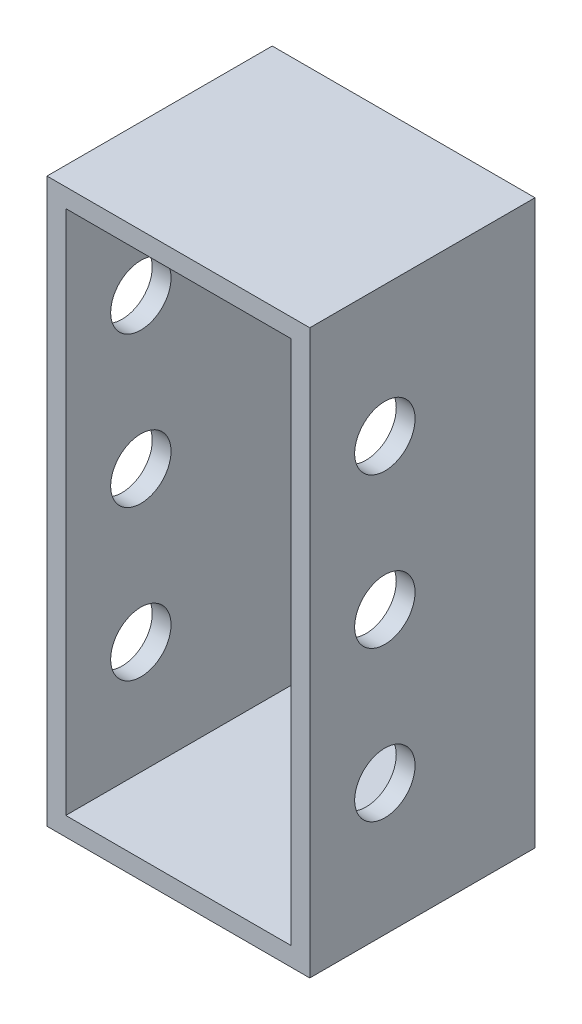
ISO-10303-21;
HEADER;
FILE_DESCRIPTION(('STEP AP214'),'2;1');
FILE_NAME('part.step','',(''),(''),'','','');
FILE_SCHEMA(('AUTOMOTIVE_DESIGN { 1 0 10303 214 1 1 1 1 }'));
ENDSEC;
DATA;
#1=APPLICATION_CONTEXT('core data for automotive mechanical design processes');
#2=APPLICATION_PROTOCOL_DEFINITION('international standard','automotive_design',2000,#1);
#3=PRODUCT_CONTEXT('',#1,'mechanical');
#4=PRODUCT('Part','Part','',(#3));
#5=PRODUCT_RELATED_PRODUCT_CATEGORY('part','',(#4));
#6=PRODUCT_DEFINITION_FORMATION('','',#4);
#7=PRODUCT_DEFINITION_CONTEXT('part definition',#1,'design');
#8=PRODUCT_DEFINITION('design','',#6,#7);
#9=PRODUCT_DEFINITION_SHAPE('','',#8);
#10=(LENGTH_UNIT() NAMED_UNIT(*) SI_UNIT(.MILLI.,.METRE.));
#11=(NAMED_UNIT(*) PLANE_ANGLE_UNIT() SI_UNIT($,.RADIAN.));
#12=(NAMED_UNIT(*) SI_UNIT($,.STERADIAN.) SOLID_ANGLE_UNIT());
#13=UNCERTAINTY_MEASURE_WITH_UNIT(LENGTH_MEASURE(1.E-05),#10,'distance_accuracy_value','');
#14=(GEOMETRIC_REPRESENTATION_CONTEXT(3) GLOBAL_UNCERTAINTY_ASSIGNED_CONTEXT((#13)) GLOBAL_UNIT_ASSIGNED_CONTEXT((#10,
#11,#12)) REPRESENTATION_CONTEXT('',''));
#15=CARTESIAN_POINT('',(0.,0.,0.));
#16=DIRECTION('',(0.,0.,1.));
#17=DIRECTION('',(1.,0.,0.));
#18=AXIS2_PLACEMENT_3D('',#15,#16,#17);
#19=CARTESIAN_POINT('',(0.,23.8125,0.));
#20=DIRECTION('',(0.,0.,1.));
#21=DIRECTION('',(-1.,0.,0.));
#22=AXIS2_PLACEMENT_3D('',#19,#20,#21);
#23=PLANE('',#22);
#24=DIRECTION('',(1.,0.,0.));
#25=VECTOR('',#24,1.);
#26=CARTESIAN_POINT('',(0.,-23.8125,0.));
#27=LINE('',#26,#25);
#28=CARTESIAN_POINT('',(0.,-23.8125,0.));
#29=VERTEX_POINT('',#28);
#30=CARTESIAN_POINT('',(22.225,-23.8125,0.));
#31=VERTEX_POINT('',#30);
#32=EDGE_CURVE('E180',#29,#31,#27,.T.);
#33=ORIENTED_EDGE('',*,*,#32,.F.);
#34=DIRECTION('',(0.,-1.,0.));
#35=VECTOR('',#34,1.);
#36=CARTESIAN_POINT('',(0.,23.8125,0.));
#37=LINE('',#36,#35);
#38=CARTESIAN_POINT('',(0.,23.8125,0.));
#39=VERTEX_POINT('',#38);
#40=EDGE_CURVE('E11',#39,#29,#37,.T.);
#41=ORIENTED_EDGE('',*,*,#40,.F.);
#42=DIRECTION('',(1.,0.,0.));
#43=VECTOR('',#42,1.);
#44=CARTESIAN_POINT('',(0.,23.8125,0.));
#45=LINE('',#44,#43);
#46=CARTESIAN_POINT('',(22.225,23.8125,0.));
#47=VERTEX_POINT('',#46);
#48=EDGE_CURVE('E169',#39,#47,#45,.T.);
#49=ORIENTED_EDGE('',*,*,#48,.T.);
#50=DIRECTION('',(0.,-1.,0.));
#51=VECTOR('',#50,1.);
#52=CARTESIAN_POINT('',(22.225,23.8125,0.));
#53=LINE('',#52,#51);
#54=EDGE_CURVE('E45',#47,#31,#53,.T.);
#55=ORIENTED_EDGE('',*,*,#54,.T.);
#56=EDGE_LOOP('',(#33,#41,#49,#55));
#57=FACE_BOUND('',#56,.T.);
#58=DIRECTION('',(1.,0.,0.));
#59=VECTOR('',#58,1.);
#60=CARTESIAN_POINT('',(0.,-22.225,0.));
#61=LINE('',#60,#59);
#62=CARTESIAN_POINT('',(1.5875,-22.225,0.));
#63=VERTEX_POINT('',#62);
#64=CARTESIAN_POINT('',(20.6375,-22.225,0.));
#65=VERTEX_POINT('',#64);
#66=EDGE_CURVE('E111',#63,#65,#61,.T.);
#67=ORIENTED_EDGE('',*,*,#66,.T.);
#68=DIRECTION('',(0.,-1.,0.));
#69=VECTOR('',#68,1.);
#70=CARTESIAN_POINT('',(20.6375,23.8125,0.));
#71=LINE('',#70,#69);
#72=CARTESIAN_POINT('',(20.6375,22.225,0.));
#73=VERTEX_POINT('',#72);
#74=EDGE_CURVE('E119',#73,#65,#71,.T.);
#75=ORIENTED_EDGE('',*,*,#74,.F.);
#76=DIRECTION('',(1.,0.,0.));
#77=VECTOR('',#76,1.);
#78=CARTESIAN_POINT('',(0.,22.225,0.));
#79=LINE('',#78,#77);
#80=CARTESIAN_POINT('',(1.5875,22.225,0.));
#81=VERTEX_POINT('',#80);
#82=EDGE_CURVE('E117',#81,#73,#79,.T.);
#83=ORIENTED_EDGE('',*,*,#82,.F.);
#84=DIRECTION('',(0.,-1.,0.));
#85=VECTOR('',#84,1.);
#86=CARTESIAN_POINT('',(1.5875,23.8125,0.));
#87=LINE('',#86,#85);
#88=EDGE_CURVE('E103',#81,#63,#87,.T.);
#89=ORIENTED_EDGE('',*,*,#88,.T.);
#90=EDGE_LOOP('',(#67,#75,#83,#89));
#91=FACE_BOUND('',#90,.T.);
#92=ADVANCED_FACE('F37',(#57,#91),#23,.F.);
#93=CARTESIAN_POINT('',(0.,23.8125,19.05));
#94=DIRECTION('',(0.,0.,-1.));
#95=DIRECTION('',(1.,0.,0.));
#96=AXIS2_PLACEMENT_3D('',#93,#94,#95);
#97=PLANE('',#96);
#98=DIRECTION('',(-1.,0.,0.));
#99=VECTOR('',#98,1.);
#100=CARTESIAN_POINT('',(0.,-23.8125,19.05));
#101=LINE('',#100,#99);
#102=CARTESIAN_POINT('',(22.225,-23.8125,19.05));
#103=VERTEX_POINT('',#102);
#104=CARTESIAN_POINT('',(0.,-23.8125,19.05));
#105=VERTEX_POINT('',#104);
#106=EDGE_CURVE('E170',#103,#105,#101,.T.);
#107=ORIENTED_EDGE('',*,*,#106,.F.);
#108=DIRECTION('',(0.,-1.,0.));
#109=VECTOR('',#108,1.);
#110=CARTESIAN_POINT('',(22.225,23.8125,19.05));
#111=LINE('',#110,#109);
#112=CARTESIAN_POINT('',(22.225,23.8125,19.05));
#113=VERTEX_POINT('',#112);
#114=EDGE_CURVE('E189',#113,#103,#111,.T.);
#115=ORIENTED_EDGE('',*,*,#114,.F.);
#116=DIRECTION('',(-1.,0.,0.));
#117=VECTOR('',#116,1.);
#118=CARTESIAN_POINT('',(0.,23.8125,19.05));
#119=LINE('',#118,#117);
#120=CARTESIAN_POINT('',(0.,23.8125,19.05));
#121=VERTEX_POINT('',#120);
#122=EDGE_CURVE('E175',#113,#121,#119,.T.);
#123=ORIENTED_EDGE('',*,*,#122,.T.);
#124=DIRECTION('',(0.,-1.,0.));
#125=VECTOR('',#124,1.);
#126=CARTESIAN_POINT('',(0.,23.8125,19.05));
#127=LINE('',#126,#125);
#128=EDGE_CURVE('E178',#121,#105,#127,.T.);
#129=ORIENTED_EDGE('',*,*,#128,.T.);
#130=EDGE_LOOP('',(#107,#115,#123,#129));
#131=FACE_BOUND('',#130,.T.);
#132=DIRECTION('',(-1.,0.,0.));
#133=VECTOR('',#132,1.);
#134=CARTESIAN_POINT('',(0.,-22.225,19.05));
#135=LINE('',#134,#133);
#136=CARTESIAN_POINT('',(20.6375,-22.225,19.05));
#137=VERTEX_POINT('',#136);
#138=CARTESIAN_POINT('',(1.5875,-22.225,19.05));
#139=VERTEX_POINT('',#138);
#140=EDGE_CURVE('E125',#137,#139,#135,.T.);
#141=ORIENTED_EDGE('',*,*,#140,.T.);
#142=DIRECTION('',(0.,-1.,0.));
#143=VECTOR('',#142,1.);
#144=CARTESIAN_POINT('',(1.5875,23.8125,19.05));
#145=LINE('',#144,#143);
#146=CARTESIAN_POINT('',(1.5875,22.225,19.05));
#147=VERTEX_POINT('',#146);
#148=EDGE_CURVE('E106',#147,#139,#145,.T.);
#149=ORIENTED_EDGE('',*,*,#148,.F.);
#150=DIRECTION('',(-1.,0.,0.));
#151=VECTOR('',#150,1.);
#152=CARTESIAN_POINT('',(0.,22.225,19.05));
#153=LINE('',#152,#151);
#154=CARTESIAN_POINT('',(20.6375,22.225,19.05));
#155=VERTEX_POINT('',#154);
#156=EDGE_CURVE('E133',#155,#147,#153,.T.);
#157=ORIENTED_EDGE('',*,*,#156,.F.);
#158=DIRECTION('',(0.,-1.,0.));
#159=VECTOR('',#158,1.);
#160=CARTESIAN_POINT('',(20.6375,23.8125,19.05));
#161=LINE('',#160,#159);
#162=EDGE_CURVE('E130',#155,#137,#161,.T.);
#163=ORIENTED_EDGE('',*,*,#162,.T.);
#164=EDGE_LOOP('',(#141,#149,#157,#163));
#165=FACE_BOUND('',#164,.T.);
#166=ADVANCED_FACE('F209',(#131,#165),#97,.F.);
#167=CARTESIAN_POINT('',(22.225,0.,12.7));
#168=DIRECTION('',(-1.,0.,0.));
#169=DIRECTION('',(0.,0.,-1.));
#170=AXIS2_PLACEMENT_3D('',#167,#168,#169);
#171=CYLINDRICAL_SURFACE('',#170,2.5527);
#172=CARTESIAN_POINT('',(0.,0.,12.7));
#173=DIRECTION('',(1.,0.,0.));
#174=DIRECTION('',(0.,0.,-1.));
#175=AXIS2_PLACEMENT_3D('',#172,#173,#174);
#176=CIRCLE('',#175,2.5527);
#177=CARTESIAN_POINT('',(0.,0.,10.1473));
#178=VERTEX_POINT('',#177);
#179=EDGE_CURVE('E118',#178,#178,#176,.T.);
#180=ORIENTED_EDGE('',*,*,#179,.F.);
#181=EDGE_LOOP('',(#180));
#182=FACE_BOUND('',#181,.T.);
#183=CARTESIAN_POINT('',(1.5875,0.,12.7));
#184=DIRECTION('',(-1.,0.,0.));
#185=DIRECTION('',(0.,0.,1.));
#186=AXIS2_PLACEMENT_3D('',#183,#184,#185);
#187=CIRCLE('',#186,2.5527);
#188=CARTESIAN_POINT('',(1.5875,0.,15.2527));
#189=VERTEX_POINT('',#188);
#190=EDGE_CURVE('E148',#189,#189,#187,.F.);
#191=ORIENTED_EDGE('',*,*,#190,.T.);
#192=EDGE_LOOP('',(#191));
#193=FACE_BOUND('',#192,.T.);
#194=ADVANCED_FACE('F212',(#182,#193),#171,.F.);
#195=CARTESIAN_POINT('',(22.225,-12.7,12.7));
#196=DIRECTION('',(-1.,0.,0.));
#197=DIRECTION('',(0.,0.,-1.));
#198=AXIS2_PLACEMENT_3D('',#195,#196,#197);
#199=CYLINDRICAL_SURFACE('',#198,2.5527);
#200=CARTESIAN_POINT('',(0.,-12.7,12.7));
#201=DIRECTION('',(1.,0.,0.));
#202=DIRECTION('',(0.,0.,-1.));
#203=AXIS2_PLACEMENT_3D('',#200,#201,#202);
#204=CIRCLE('',#203,2.5527);
#205=CARTESIAN_POINT('',(0.,-12.7,10.1473));
#206=VERTEX_POINT('',#205);
#207=EDGE_CURVE('E159',#206,#206,#204,.T.);
#208=ORIENTED_EDGE('',*,*,#207,.F.);
#209=EDGE_LOOP('',(#208));
#210=FACE_BOUND('',#209,.T.);
#211=CARTESIAN_POINT('',(1.5875,-12.7,12.7));
#212=DIRECTION('',(-1.,0.,0.));
#213=DIRECTION('',(0.,0.,1.));
#214=AXIS2_PLACEMENT_3D('',#211,#212,#213);
#215=CIRCLE('',#214,2.5527);
#216=CARTESIAN_POINT('',(1.5875,-12.7,15.2527));
#217=VERTEX_POINT('',#216);
#218=EDGE_CURVE('E144',#217,#217,#215,.F.);
#219=ORIENTED_EDGE('',*,*,#218,.T.);
#220=EDGE_LOOP('',(#219));
#221=FACE_BOUND('',#220,.T.);
#222=ADVANCED_FACE('F248',(#210,#221),#199,.F.);
#223=CARTESIAN_POINT('',(22.225,12.7,12.7));
#224=DIRECTION('',(-1.,0.,0.));
#225=DIRECTION('',(0.,0.,-1.));
#226=AXIS2_PLACEMENT_3D('',#223,#224,#225);
#227=CYLINDRICAL_SURFACE('',#226,2.5527);
#228=CARTESIAN_POINT('',(0.,12.7,12.7));
#229=DIRECTION('',(1.,0.,0.));
#230=DIRECTION('',(0.,0.,-1.));
#231=AXIS2_PLACEMENT_3D('',#228,#229,#230);
#232=CIRCLE('',#231,2.5527);
#233=CARTESIAN_POINT('',(0.,12.7,10.1473));
#234=VERTEX_POINT('',#233);
#235=EDGE_CURVE('E153',#234,#234,#232,.T.);
#236=ORIENTED_EDGE('',*,*,#235,.F.);
#237=EDGE_LOOP('',(#236));
#238=FACE_BOUND('',#237,.T.);
#239=CARTESIAN_POINT('',(1.5875,12.7,12.7));
#240=DIRECTION('',(-1.,0.,0.));
#241=DIRECTION('',(0.,0.,1.));
#242=AXIS2_PLACEMENT_3D('',#239,#240,#241);
#243=CIRCLE('',#242,2.5527);
#244=CARTESIAN_POINT('',(1.5875,12.7,15.2527));
#245=VERTEX_POINT('',#244);
#246=EDGE_CURVE('E140',#245,#245,#243,.F.);
#247=ORIENTED_EDGE('',*,*,#246,.T.);
#248=EDGE_LOOP('',(#247));
#249=FACE_BOUND('',#248,.T.);
#250=ADVANCED_FACE('F251',(#238,#249),#227,.F.);
#251=CARTESIAN_POINT('',(0.,23.8125,0.));
#252=DIRECTION('',(1.,0.,0.));
#253=DIRECTION('',(0.,0.,1.));
#254=AXIS2_PLACEMENT_3D('',#251,#252,#253);
#255=PLANE('',#254);
#256=ORIENTED_EDGE('',*,*,#235,.T.);
#257=EDGE_LOOP('',(#256));
#258=FACE_BOUND('',#257,.T.);
#259=ORIENTED_EDGE('',*,*,#207,.T.);
#260=EDGE_LOOP('',(#259));
#261=FACE_BOUND('',#260,.T.);
#262=ORIENTED_EDGE('',*,*,#179,.T.);
#263=EDGE_LOOP('',(#262));
#264=FACE_BOUND('',#263,.T.);
#265=DIRECTION('',(0.,0.,-1.));
#266=VECTOR('',#265,1.);
#267=CARTESIAN_POINT('',(0.,-23.8125,0.));
#268=LINE('',#267,#266);
#269=EDGE_CURVE('E152',#105,#29,#268,.T.);
#270=ORIENTED_EDGE('',*,*,#269,.F.);
#271=ORIENTED_EDGE('',*,*,#128,.F.);
#272=DIRECTION('',(0.,0.,-1.));
#273=VECTOR('',#272,1.);
#274=CARTESIAN_POINT('',(0.,23.8125,0.));
#275=LINE('',#274,#273);
#276=EDGE_CURVE('E167',#121,#39,#275,.T.);
#277=ORIENTED_EDGE('',*,*,#276,.T.);
#278=ORIENTED_EDGE('',*,*,#40,.T.);
#279=EDGE_LOOP('',(#270,#271,#277,#278));
#280=FACE_BOUND('',#279,.T.);
#281=ADVANCED_FACE('F39',(#258,#261,#264,#280),#255,.F.);
#282=CARTESIAN_POINT('',(22.225,23.8125,0.));
#283=DIRECTION('',(-1.,0.,0.));
#284=DIRECTION('',(0.,0.,-1.));
#285=AXIS2_PLACEMENT_3D('',#282,#283,#284);
#286=PLANE('',#285);
#287=CARTESIAN_POINT('',(22.225,12.7,12.7));
#288=DIRECTION('',(1.,0.,0.));
#289=DIRECTION('',(0.,0.,-1.));
#290=AXIS2_PLACEMENT_3D('',#287,#288,#289);
#291=CIRCLE('',#290,2.5527);
#292=CARTESIAN_POINT('',(22.225,12.7,10.1473));
#293=VERTEX_POINT('',#292);
#294=EDGE_CURVE('E149',#293,#293,#291,.T.);
#295=ORIENTED_EDGE('',*,*,#294,.F.);
#296=EDGE_LOOP('',(#295));
#297=FACE_BOUND('',#296,.T.);
#298=CARTESIAN_POINT('',(22.225,-12.7,12.7));
#299=DIRECTION('',(1.,0.,0.));
#300=DIRECTION('',(0.,0.,-1.));
#301=AXIS2_PLACEMENT_3D('',#298,#299,#300);
#302=CIRCLE('',#301,2.5527);
#303=CARTESIAN_POINT('',(22.225,-12.7,10.1473));
#304=VERTEX_POINT('',#303);
#305=EDGE_CURVE('E156',#304,#304,#302,.T.);
#306=ORIENTED_EDGE('',*,*,#305,.F.);
#307=EDGE_LOOP('',(#306));
#308=FACE_BOUND('',#307,.T.);
#309=CARTESIAN_POINT('',(22.225,0.,12.7));
#310=DIRECTION('',(1.,0.,0.));
#311=DIRECTION('',(0.,0.,-1.));
#312=AXIS2_PLACEMENT_3D('',#309,#310,#311);
#313=CIRCLE('',#312,2.5527);
#314=CARTESIAN_POINT('',(22.225,0.,10.1473));
#315=VERTEX_POINT('',#314);
#316=EDGE_CURVE('E162',#315,#315,#313,.T.);
#317=ORIENTED_EDGE('',*,*,#316,.F.);
#318=EDGE_LOOP('',(#317));
#319=FACE_BOUND('',#318,.T.);
#320=DIRECTION('',(0.,0.,1.));
#321=VECTOR('',#320,1.);
#322=CARTESIAN_POINT('',(22.225,-23.8125,0.));
#323=LINE('',#322,#321);
#324=EDGE_CURVE('E183',#31,#103,#323,.T.);
#325=ORIENTED_EDGE('',*,*,#324,.F.);
#326=ORIENTED_EDGE('',*,*,#54,.F.);
#327=DIRECTION('',(0.,0.,1.));
#328=VECTOR('',#327,1.);
#329=CARTESIAN_POINT('',(22.225,23.8125,0.));
#330=LINE('',#329,#328);
#331=EDGE_CURVE('E173',#47,#113,#330,.T.);
#332=ORIENTED_EDGE('',*,*,#331,.T.);
#333=ORIENTED_EDGE('',*,*,#114,.T.);
#334=EDGE_LOOP('',(#325,#326,#332,#333));
#335=FACE_BOUND('',#334,.T.);
#336=ADVANCED_FACE('F207',(#297,#308,#319,#335),#286,.F.);
#337=CARTESIAN_POINT('',(0.,23.8125,0.));
#338=DIRECTION('',(0.,-1.,0.));
#339=DIRECTION('',(0.,0.,1.));
#340=AXIS2_PLACEMENT_3D('',#337,#338,#339);
#341=PLANE('',#340);
#342=ORIENTED_EDGE('',*,*,#276,.F.);
#343=ORIENTED_EDGE('',*,*,#122,.F.);
#344=ORIENTED_EDGE('',*,*,#331,.F.);
#345=ORIENTED_EDGE('',*,*,#48,.F.);
#346=EDGE_LOOP('',(#342,#343,#344,#345));
#347=FACE_BOUND('',#346,.T.);
#348=ADVANCED_FACE('F205',(#347),#341,.F.);
#349=CARTESIAN_POINT('',(0.,-23.8125,0.));
#350=DIRECTION('',(0.,-1.,0.));
#351=DIRECTION('',(0.,0.,1.));
#352=AXIS2_PLACEMENT_3D('',#349,#350,#351);
#353=PLANE('',#352);
#354=ORIENTED_EDGE('',*,*,#269,.T.);
#355=ORIENTED_EDGE('',*,*,#32,.T.);
#356=ORIENTED_EDGE('',*,*,#324,.T.);
#357=ORIENTED_EDGE('',*,*,#106,.T.);
#358=EDGE_LOOP('',(#354,#355,#356,#357));
#359=FACE_BOUND('',#358,.T.);
#360=ADVANCED_FACE('F199',(#359),#353,.T.);
#361=CARTESIAN_POINT('',(20.6375,0.,12.7));
#362=DIRECTION('',(1.,0.,0.));
#363=DIRECTION('',(0.,0.,-1.));
#364=AXIS2_PLACEMENT_3D('',#361,#362,#363);
#365=CIRCLE('',#364,2.5527);
#366=CARTESIAN_POINT('',(20.6375,0.,10.1473));
#367=VERTEX_POINT('',#366);
#368=EDGE_CURVE('E145',#367,#367,#365,.T.);
#369=ORIENTED_EDGE('',*,*,#368,.F.);
#370=EDGE_LOOP('',(#369));
#371=FACE_BOUND('',#370,.T.);
#372=ORIENTED_EDGE('',*,*,#316,.T.);
#373=EDGE_LOOP('',(#372));
#374=FACE_BOUND('',#373,.T.);
#375=ADVANCED_FACE('F237',(#371,#374),#171,.F.);
#376=CARTESIAN_POINT('',(20.6375,-12.7,12.7));
#377=DIRECTION('',(1.,0.,0.));
#378=DIRECTION('',(0.,0.,-1.));
#379=AXIS2_PLACEMENT_3D('',#376,#377,#378);
#380=CIRCLE('',#379,2.5527);
#381=CARTESIAN_POINT('',(20.6375,-12.7,10.1473));
#382=VERTEX_POINT('',#381);
#383=EDGE_CURVE('E141',#382,#382,#380,.T.);
#384=ORIENTED_EDGE('',*,*,#383,.F.);
#385=EDGE_LOOP('',(#384));
#386=FACE_BOUND('',#385,.T.);
#387=ORIENTED_EDGE('',*,*,#305,.T.);
#388=EDGE_LOOP('',(#387));
#389=FACE_BOUND('',#388,.T.);
#390=ADVANCED_FACE('F242',(#386,#389),#199,.F.);
#391=CARTESIAN_POINT('',(20.6375,12.7,12.7));
#392=DIRECTION('',(1.,0.,0.));
#393=DIRECTION('',(0.,0.,-1.));
#394=AXIS2_PLACEMENT_3D('',#391,#392,#393);
#395=CIRCLE('',#394,2.5527);
#396=CARTESIAN_POINT('',(20.6375,12.7,10.1473));
#397=VERTEX_POINT('',#396);
#398=EDGE_CURVE('E112',#397,#397,#395,.T.);
#399=ORIENTED_EDGE('',*,*,#398,.F.);
#400=EDGE_LOOP('',(#399));
#401=FACE_BOUND('',#400,.T.);
#402=ORIENTED_EDGE('',*,*,#294,.T.);
#403=EDGE_LOOP('',(#402));
#404=FACE_BOUND('',#403,.T.);
#405=ADVANCED_FACE('F246',(#401,#404),#227,.F.);
#406=CARTESIAN_POINT('',(1.5875,23.8125,0.));
#407=DIRECTION('',(1.,0.,0.));
#408=DIRECTION('',(0.,0.,1.));
#409=AXIS2_PLACEMENT_3D('',#406,#407,#408);
#410=PLANE('',#409);
#411=ORIENTED_EDGE('',*,*,#246,.F.);
#412=EDGE_LOOP('',(#411));
#413=FACE_BOUND('',#412,.T.);
#414=ORIENTED_EDGE('',*,*,#218,.F.);
#415=EDGE_LOOP('',(#414));
#416=FACE_BOUND('',#415,.T.);
#417=ORIENTED_EDGE('',*,*,#190,.F.);
#418=EDGE_LOOP('',(#417));
#419=FACE_BOUND('',#418,.T.);
#420=DIRECTION('',(0.,0.,-1.));
#421=VECTOR('',#420,1.);
#422=CARTESIAN_POINT('',(1.5875,-22.225,0.));
#423=LINE('',#422,#421);
#424=EDGE_CURVE('E100',#139,#63,#423,.T.);
#425=ORIENTED_EDGE('',*,*,#424,.T.);
#426=ORIENTED_EDGE('',*,*,#88,.F.);
#427=DIRECTION('',(0.,0.,-1.));
#428=VECTOR('',#427,1.);
#429=CARTESIAN_POINT('',(1.5875,22.225,0.));
#430=LINE('',#429,#428);
#431=EDGE_CURVE('E52',#147,#81,#430,.T.);
#432=ORIENTED_EDGE('',*,*,#431,.F.);
#433=ORIENTED_EDGE('',*,*,#148,.T.);
#434=EDGE_LOOP('',(#425,#426,#432,#433));
#435=FACE_BOUND('',#434,.T.);
#436=ADVANCED_FACE('F102',(#413,#416,#419,#435),#410,.T.);
#437=CARTESIAN_POINT('',(20.6375,23.8125,0.));
#438=DIRECTION('',(-1.,0.,0.));
#439=DIRECTION('',(0.,0.,-1.));
#440=AXIS2_PLACEMENT_3D('',#437,#438,#439);
#441=PLANE('',#440);
#442=ORIENTED_EDGE('',*,*,#398,.T.);
#443=EDGE_LOOP('',(#442));
#444=FACE_BOUND('',#443,.T.);
#445=ORIENTED_EDGE('',*,*,#383,.T.);
#446=EDGE_LOOP('',(#445));
#447=FACE_BOUND('',#446,.T.);
#448=ORIENTED_EDGE('',*,*,#368,.T.);
#449=EDGE_LOOP('',(#448));
#450=FACE_BOUND('',#449,.T.);
#451=DIRECTION('',(0.,0.,1.));
#452=VECTOR('',#451,1.);
#453=CARTESIAN_POINT('',(20.6375,-22.225,0.));
#454=LINE('',#453,#452);
#455=EDGE_CURVE('E122',#65,#137,#454,.T.);
#456=ORIENTED_EDGE('',*,*,#455,.T.);
#457=ORIENTED_EDGE('',*,*,#162,.F.);
#458=DIRECTION('',(0.,0.,1.));
#459=VECTOR('',#458,1.);
#460=CARTESIAN_POINT('',(20.6375,22.225,0.));
#461=LINE('',#460,#459);
#462=EDGE_CURVE('E57',#73,#155,#461,.T.);
#463=ORIENTED_EDGE('',*,*,#462,.F.);
#464=ORIENTED_EDGE('',*,*,#74,.T.);
#465=EDGE_LOOP('',(#456,#457,#463,#464));
#466=FACE_BOUND('',#465,.T.);
#467=ADVANCED_FACE('F216',(#444,#447,#450,#466),#441,.T.);
#468=CARTESIAN_POINT('',(0.,22.225,0.));
#469=DIRECTION('',(0.,-1.,0.));
#470=DIRECTION('',(0.,0.,1.));
#471=AXIS2_PLACEMENT_3D('',#468,#469,#470);
#472=PLANE('',#471);
#473=ORIENTED_EDGE('',*,*,#431,.T.);
#474=ORIENTED_EDGE('',*,*,#82,.T.);
#475=ORIENTED_EDGE('',*,*,#462,.T.);
#476=ORIENTED_EDGE('',*,*,#156,.T.);
#477=EDGE_LOOP('',(#473,#474,#475,#476));
#478=FACE_BOUND('',#477,.T.);
#479=ADVANCED_FACE('F218',(#478),#472,.T.);
#480=CARTESIAN_POINT('',(0.,-22.225,0.));
#481=DIRECTION('',(0.,-1.,0.));
#482=DIRECTION('',(0.,0.,1.));
#483=AXIS2_PLACEMENT_3D('',#480,#481,#482);
#484=PLANE('',#483);
#485=ORIENTED_EDGE('',*,*,#424,.F.);
#486=ORIENTED_EDGE('',*,*,#140,.F.);
#487=ORIENTED_EDGE('',*,*,#455,.F.);
#488=ORIENTED_EDGE('',*,*,#66,.F.);
#489=EDGE_LOOP('',(#485,#486,#487,#488));
#490=FACE_BOUND('',#489,.T.);
#491=ADVANCED_FACE('F121',(#490),#484,.F.);
#492=CLOSED_SHELL('',(#92,#166,#194,#222,#250,#281,#336,#348,#360,#375,#390,#405,#436,#467,#479,#491));
#493=MANIFOLD_SOLID_BREP('B2',#492);
#494=ADVANCED_BREP_SHAPE_REPRESENTATION('',(#18,#493),#14);
#495=SHAPE_DEFINITION_REPRESENTATION(#9,#494);
ENDSEC;
END-ISO-10303-21;
